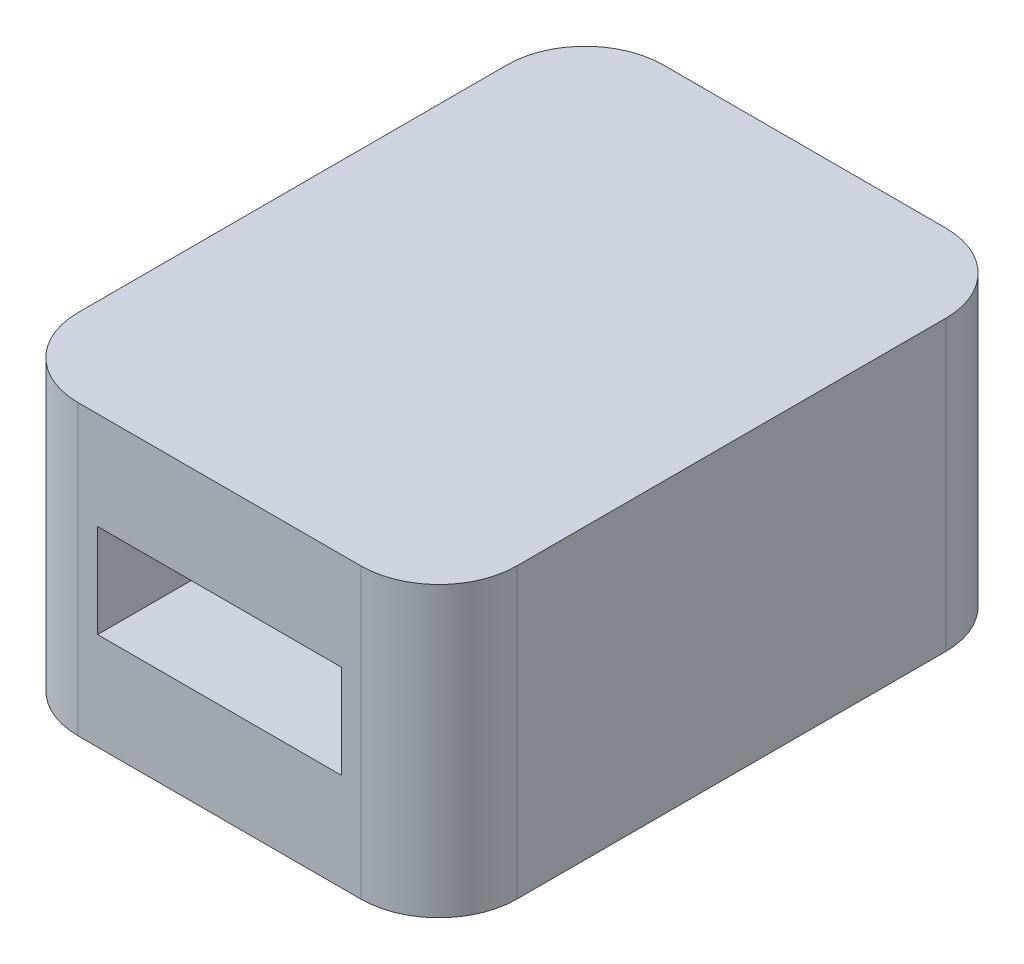
ISO-10303-21;
HEADER;
FILE_DESCRIPTION(('STEP AP214'),'2;1');
FILE_NAME('part.step','',(''),(''),'','','');
FILE_SCHEMA(('AUTOMOTIVE_DESIGN { 1 0 10303 214 1 1 1 1 }'));
ENDSEC;
DATA;
#1=APPLICATION_CONTEXT('core data for automotive mechanical design processes');
#2=APPLICATION_PROTOCOL_DEFINITION('international standard','automotive_design',2000,#1);
#3=PRODUCT_CONTEXT('',#1,'mechanical');
#4=PRODUCT('Part','Part','',(#3));
#5=PRODUCT_RELATED_PRODUCT_CATEGORY('part','',(#4));
#6=PRODUCT_DEFINITION_FORMATION('','',#4);
#7=PRODUCT_DEFINITION_CONTEXT('part definition',#1,'design');
#8=PRODUCT_DEFINITION('design','',#6,#7);
#9=PRODUCT_DEFINITION_SHAPE('','',#8);
#10=(LENGTH_UNIT() NAMED_UNIT(*) SI_UNIT(.MILLI.,.METRE.));
#11=(NAMED_UNIT(*) PLANE_ANGLE_UNIT() SI_UNIT($,.RADIAN.));
#12=(NAMED_UNIT(*) SI_UNIT($,.STERADIAN.) SOLID_ANGLE_UNIT());
#13=UNCERTAINTY_MEASURE_WITH_UNIT(LENGTH_MEASURE(1.E-05),#10,'distance_accuracy_value','');
#14=(GEOMETRIC_REPRESENTATION_CONTEXT(3) GLOBAL_UNCERTAINTY_ASSIGNED_CONTEXT((#13)) GLOBAL_UNIT_ASSIGNED_CONTEXT((#10,
#11,#12)) REPRESENTATION_CONTEXT('',''));
#15=CARTESIAN_POINT('',(0.,0.,0.));
#16=DIRECTION('',(0.,0.,1.));
#17=DIRECTION('',(1.,0.,0.));
#18=AXIS2_PLACEMENT_3D('',#15,#16,#17);
#19=CARTESIAN_POINT('',(0.,0.,15.));
#20=DIRECTION('',(0.,0.,-1.));
#21=DIRECTION('',(-1.,0.,0.));
#22=AXIS2_PLACEMENT_3D('',#19,#20,#21);
#23=PLANE('',#22);
#24=DIRECTION('',(1.,0.,0.));
#25=VECTOR('',#24,1.);
#26=CARTESIAN_POINT('',(-5.625,-3.7,15.));
#27=LINE('',#26,#25);
#28=CARTESIAN_POINT('',(-3.625,-3.7,15.));
#29=VERTEX_POINT('',#28);
#30=CARTESIAN_POINT('',(3.625,-3.7,15.));
#31=VERTEX_POINT('',#30);
#32=EDGE_CURVE('E173',#29,#31,#27,.T.);
#33=ORIENTED_EDGE('',*,*,#32,.T.);
#34=DIRECTION('',(0.,1.,0.));
#35=VECTOR('',#34,1.);
#36=CARTESIAN_POINT('',(3.625,0.,15.));
#37=LINE('',#36,#35);
#38=CARTESIAN_POINT('',(3.625,3.7,15.));
#39=VERTEX_POINT('',#38);
#40=EDGE_CURVE('E11',#31,#39,#37,.T.);
#41=ORIENTED_EDGE('',*,*,#40,.T.);
#42=DIRECTION('',(-1.,0.,0.));
#43=VECTOR('',#42,1.);
#44=CARTESIAN_POINT('',(-5.625,3.7,15.));
#45=LINE('',#44,#43);
#46=CARTESIAN_POINT('',(-3.625,3.7,15.));
#47=VERTEX_POINT('',#46);
#48=EDGE_CURVE('E170',#39,#47,#45,.T.);
#49=ORIENTED_EDGE('',*,*,#48,.T.);
#50=DIRECTION('',(0.,-1.,0.));
#51=VECTOR('',#50,1.);
#52=CARTESIAN_POINT('',(-3.625,0.,15.));
#53=LINE('',#52,#51);
#54=EDGE_CURVE('E45',#47,#29,#53,.T.);
#55=ORIENTED_EDGE('',*,*,#54,.T.);
#56=EDGE_LOOP('',(#33,#41,#49,#55));
#57=FACE_BOUND('',#56,.T.);
#58=DIRECTION('',(0.,1.,0.));
#59=VECTOR('',#58,1.);
#60=CARTESIAN_POINT('',(3.125,-1.2,15.));
#61=LINE('',#60,#59);
#62=CARTESIAN_POINT('',(3.125,-1.2,15.));
#63=VERTEX_POINT('',#62);
#64=CARTESIAN_POINT('',(3.125,1.2,15.));
#65=VERTEX_POINT('',#64);
#66=EDGE_CURVE('E129',#63,#65,#61,.T.);
#67=ORIENTED_EDGE('',*,*,#66,.F.);
#68=DIRECTION('',(1.,0.,0.));
#69=VECTOR('',#68,1.);
#70=CARTESIAN_POINT('',(-3.125,-1.2,15.));
#71=LINE('',#70,#69);
#72=CARTESIAN_POINT('',(-3.125,-1.2,15.));
#73=VERTEX_POINT('',#72);
#74=EDGE_CURVE('E154',#73,#63,#71,.T.);
#75=ORIENTED_EDGE('',*,*,#74,.F.);
#76=DIRECTION('',(0.,-1.,0.));
#77=VECTOR('',#76,1.);
#78=CARTESIAN_POINT('',(-3.125,-1.2,15.));
#79=LINE('',#78,#77);
#80=CARTESIAN_POINT('',(-3.125,1.2,15.));
#81=VERTEX_POINT('',#80);
#82=EDGE_CURVE('E152',#81,#73,#79,.T.);
#83=ORIENTED_EDGE('',*,*,#82,.F.);
#84=DIRECTION('',(-1.,0.,0.));
#85=VECTOR('',#84,1.);
#86=CARTESIAN_POINT('',(-3.125,1.2,15.));
#87=LINE('',#86,#85);
#88=EDGE_CURVE('E139',#65,#81,#87,.T.);
#89=ORIENTED_EDGE('',*,*,#88,.F.);
#90=EDGE_LOOP('',(#67,#75,#83,#89));
#91=FACE_BOUND('',#90,.T.);
#92=ADVANCED_FACE('F37',(#57,#91),#23,.F.);
#93=CARTESIAN_POINT('',(0.,0.,0.));
#94=DIRECTION('',(0.,0.,-1.));
#95=DIRECTION('',(-1.,0.,0.));
#96=AXIS2_PLACEMENT_3D('',#93,#94,#95);
#97=PLANE('',#96);
#98=DIRECTION('',(1.,0.,0.));
#99=VECTOR('',#98,1.);
#100=CARTESIAN_POINT('',(-5.625,-3.7,0.));
#101=LINE('',#100,#99);
#102=CARTESIAN_POINT('',(-3.625,-3.7,0.));
#103=VERTEX_POINT('',#102);
#104=CARTESIAN_POINT('',(3.625,-3.7,0.));
#105=VERTEX_POINT('',#104);
#106=EDGE_CURVE('E174',#103,#105,#101,.T.);
#107=ORIENTED_EDGE('',*,*,#106,.F.);
#108=DIRECTION('',(0.,-1.,0.));
#109=VECTOR('',#108,1.);
#110=CARTESIAN_POINT('',(-3.625,3.7,0.));
#111=LINE('',#110,#109);
#112=CARTESIAN_POINT('',(-3.625,3.7,0.));
#113=VERTEX_POINT('',#112);
#114=EDGE_CURVE('E207',#103,#113,#111,.F.);
#115=ORIENTED_EDGE('',*,*,#114,.T.);
#116=DIRECTION('',(-1.,0.,0.));
#117=VECTOR('',#116,1.);
#118=CARTESIAN_POINT('',(-5.625,3.7,0.));
#119=LINE('',#118,#117);
#120=CARTESIAN_POINT('',(3.625,3.7,0.));
#121=VERTEX_POINT('',#120);
#122=EDGE_CURVE('E147',#121,#113,#119,.T.);
#123=ORIENTED_EDGE('',*,*,#122,.F.);
#124=DIRECTION('',(0.,1.,0.));
#125=VECTOR('',#124,1.);
#126=CARTESIAN_POINT('',(3.625,-3.7,0.));
#127=LINE('',#126,#125);
#128=EDGE_CURVE('E205',#121,#105,#127,.F.);
#129=ORIENTED_EDGE('',*,*,#128,.T.);
#130=EDGE_LOOP('',(#107,#115,#123,#129));
#131=FACE_BOUND('',#130,.T.);
#132=DIRECTION('',(1.,0.,0.));
#133=VECTOR('',#132,1.);
#134=CARTESIAN_POINT('',(-3.125,-1.2,0.));
#135=LINE('',#134,#133);
#136=CARTESIAN_POINT('',(-3.125,-1.2,0.));
#137=VERTEX_POINT('',#136);
#138=CARTESIAN_POINT('',(3.125,-1.2,0.));
#139=VERTEX_POINT('',#138);
#140=EDGE_CURVE('E140',#137,#139,#135,.T.);
#141=ORIENTED_EDGE('',*,*,#140,.T.);
#142=DIRECTION('',(0.,1.,0.));
#143=VECTOR('',#142,1.);
#144=CARTESIAN_POINT('',(3.125,-1.2,0.));
#145=LINE('',#144,#143);
#146=CARTESIAN_POINT('',(3.125,1.2,0.));
#147=VERTEX_POINT('',#146);
#148=EDGE_CURVE('E158',#139,#147,#145,.T.);
#149=ORIENTED_EDGE('',*,*,#148,.T.);
#150=DIRECTION('',(-1.,0.,0.));
#151=VECTOR('',#150,1.);
#152=CARTESIAN_POINT('',(-3.125,1.2,0.));
#153=LINE('',#152,#151);
#154=CARTESIAN_POINT('',(-3.125,1.2,0.));
#155=VERTEX_POINT('',#154);
#156=EDGE_CURVE('E146',#147,#155,#153,.T.);
#157=ORIENTED_EDGE('',*,*,#156,.T.);
#158=DIRECTION('',(0.,-1.,0.));
#159=VECTOR('',#158,1.);
#160=CARTESIAN_POINT('',(-3.125,-1.2,0.));
#161=LINE('',#160,#159);
#162=EDGE_CURVE('E161',#155,#137,#161,.T.);
#163=ORIENTED_EDGE('',*,*,#162,.T.);
#164=EDGE_LOOP('',(#141,#149,#157,#163));
#165=FACE_BOUND('',#164,.T.);
#166=ADVANCED_FACE('F244',(#131,#165),#97,.T.);
#167=CARTESIAN_POINT('',(5.625,-3.7,15.));
#168=DIRECTION('',(-1.,0.,0.));
#169=DIRECTION('',(0.,-1.,0.));
#170=AXIS2_PLACEMENT_3D('',#167,#168,#169);
#171=PLANE('',#170);
#172=DIRECTION('',(0.,0.,-1.));
#173=VECTOR('',#172,1.);
#174=CARTESIAN_POINT('',(5.625,-3.7,15.));
#175=LINE('',#174,#173);
#176=CARTESIAN_POINT('',(5.625,-3.7,13.));
#177=VERTEX_POINT('',#176);
#178=CARTESIAN_POINT('',(5.625,-3.7,2.));
#179=VERTEX_POINT('',#178);
#180=EDGE_CURVE('E177',#177,#179,#175,.T.);
#181=ORIENTED_EDGE('',*,*,#180,.T.);
#182=DIRECTION('',(0.,1.,0.));
#183=VECTOR('',#182,1.);
#184=CARTESIAN_POINT('',(5.625,3.7,2.));
#185=LINE('',#184,#183);
#186=CARTESIAN_POINT('',(5.625,3.7,2.));
#187=VERTEX_POINT('',#186);
#188=EDGE_CURVE('E217',#179,#187,#185,.T.);
#189=ORIENTED_EDGE('',*,*,#188,.T.);
#190=DIRECTION('',(0.,0.,-1.));
#191=VECTOR('',#190,1.);
#192=CARTESIAN_POINT('',(5.625,3.7,15.));
#193=LINE('',#192,#191);
#194=CARTESIAN_POINT('',(5.625,3.7,13.));
#195=VERTEX_POINT('',#194);
#196=EDGE_CURVE('E190',#195,#187,#193,.T.);
#197=ORIENTED_EDGE('',*,*,#196,.F.);
#198=DIRECTION('',(0.,1.,0.));
#199=VECTOR('',#198,1.);
#200=CARTESIAN_POINT('',(5.625,-3.7,13.));
#201=LINE('',#200,#199);
#202=EDGE_CURVE('E215',#195,#177,#201,.F.);
#203=ORIENTED_EDGE('',*,*,#202,.T.);
#204=EDGE_LOOP('',(#181,#189,#197,#203));
#205=FACE_BOUND('',#204,.T.);
#206=ADVANCED_FACE('F251',(#205),#171,.F.);
#207=CARTESIAN_POINT('',(-5.625,3.7,15.));
#208=DIRECTION('',(0.,-1.,0.));
#209=DIRECTION('',(0.,0.,-1.));
#210=AXIS2_PLACEMENT_3D('',#207,#208,#209);
#211=PLANE('',#210);
#212=ORIENTED_EDGE('',*,*,#122,.T.);
#213=CARTESIAN_POINT('',(-3.625,3.7,2.));
#214=DIRECTION('',(0.,-1.,0.));
#215=DIRECTION('',(0.,0.,-1.));
#216=AXIS2_PLACEMENT_3D('',#213,#214,#215);
#217=CIRCLE('',#216,2.);
#218=CARTESIAN_POINT('',(-5.625,3.7,2.));
#219=VERTEX_POINT('',#218);
#220=EDGE_CURVE('E213',#113,#219,#217,.F.);
#221=ORIENTED_EDGE('',*,*,#220,.T.);
#222=DIRECTION('',(0.,0.,-1.));
#223=VECTOR('',#222,1.);
#224=CARTESIAN_POINT('',(-5.625,3.7,15.));
#225=LINE('',#224,#223);
#226=CARTESIAN_POINT('',(-5.625,3.7,13.));
#227=VERTEX_POINT('',#226);
#228=EDGE_CURVE('E187',#227,#219,#225,.T.);
#229=ORIENTED_EDGE('',*,*,#228,.F.);
#230=CARTESIAN_POINT('',(-3.625,3.7,13.));
#231=DIRECTION('',(0.,-1.,0.));
#232=DIRECTION('',(0.,0.,-1.));
#233=AXIS2_PLACEMENT_3D('',#230,#231,#232);
#234=CIRCLE('',#233,2.);
#235=EDGE_CURVE('E209',#227,#47,#234,.F.);
#236=ORIENTED_EDGE('',*,*,#235,.T.);
#237=ORIENTED_EDGE('',*,*,#48,.F.);
#238=CARTESIAN_POINT('',(3.625,3.7,13.));
#239=DIRECTION('',(0.,-1.,0.));
#240=DIRECTION('',(0.,0.,-1.));
#241=AXIS2_PLACEMENT_3D('',#238,#239,#240);
#242=CIRCLE('',#241,2.);
#243=EDGE_CURVE('E60',#39,#195,#242,.F.);
#244=ORIENTED_EDGE('',*,*,#243,.T.);
#245=ORIENTED_EDGE('',*,*,#196,.T.);
#246=CARTESIAN_POINT('',(3.625,3.7,2.));
#247=DIRECTION('',(0.,-1.,0.));
#248=DIRECTION('',(0.,0.,-1.));
#249=AXIS2_PLACEMENT_3D('',#246,#247,#248);
#250=CIRCLE('',#249,2.);
#251=EDGE_CURVE('E52',#187,#121,#250,.F.);
#252=ORIENTED_EDGE('',*,*,#251,.T.);
#253=EDGE_LOOP('',(#212,#221,#229,#236,#237,#244,#245,#252));
#254=FACE_BOUND('',#253,.T.);
#255=ADVANCED_FACE('F233',(#254),#211,.F.);
#256=CARTESIAN_POINT('',(-5.625,-3.7,15.));
#257=DIRECTION('',(1.,0.,0.));
#258=DIRECTION('',(0.,1.,0.));
#259=AXIS2_PLACEMENT_3D('',#256,#257,#258);
#260=PLANE('',#259);
#261=ORIENTED_EDGE('',*,*,#228,.T.);
#262=DIRECTION('',(0.,-1.,0.));
#263=VECTOR('',#262,1.);
#264=CARTESIAN_POINT('',(-5.625,-3.7,2.));
#265=LINE('',#264,#263);
#266=CARTESIAN_POINT('',(-5.625,-3.7,2.));
#267=VERTEX_POINT('',#266);
#268=EDGE_CURVE('E194',#219,#267,#265,.T.);
#269=ORIENTED_EDGE('',*,*,#268,.T.);
#270=DIRECTION('',(0.,0.,-1.));
#271=VECTOR('',#270,1.);
#272=CARTESIAN_POINT('',(-5.625,-3.7,15.));
#273=LINE('',#272,#271);
#274=CARTESIAN_POINT('',(-5.625,-3.7,13.));
#275=VERTEX_POINT('',#274);
#276=EDGE_CURVE('E184',#275,#267,#273,.T.);
#277=ORIENTED_EDGE('',*,*,#276,.F.);
#278=DIRECTION('',(0.,-1.,0.));
#279=VECTOR('',#278,1.);
#280=CARTESIAN_POINT('',(-5.625,-3.7,13.));
#281=LINE('',#280,#279);
#282=EDGE_CURVE('E192',#275,#227,#281,.F.);
#283=ORIENTED_EDGE('',*,*,#282,.T.);
#284=EDGE_LOOP('',(#261,#269,#277,#283));
#285=FACE_BOUND('',#284,.T.);
#286=ADVANCED_FACE('F237',(#285),#260,.F.);
#287=CARTESIAN_POINT('',(-5.625,-3.7,15.));
#288=DIRECTION('',(0.,1.,0.));
#289=DIRECTION('',(0.,0.,1.));
#290=AXIS2_PLACEMENT_3D('',#287,#288,#289);
#291=PLANE('',#290);
#292=ORIENTED_EDGE('',*,*,#276,.T.);
#293=CARTESIAN_POINT('',(-3.625,-3.7,2.));
#294=DIRECTION('',(0.,1.,0.));
#295=DIRECTION('',(0.,0.,1.));
#296=AXIS2_PLACEMENT_3D('',#293,#294,#295);
#297=CIRCLE('',#296,2.);
#298=EDGE_CURVE('E203',#267,#103,#297,.F.);
#299=ORIENTED_EDGE('',*,*,#298,.T.);
#300=ORIENTED_EDGE('',*,*,#106,.T.);
#301=CARTESIAN_POINT('',(3.625,-3.7,2.));
#302=DIRECTION('',(0.,1.,0.));
#303=DIRECTION('',(0.,0.,1.));
#304=AXIS2_PLACEMENT_3D('',#301,#302,#303);
#305=CIRCLE('',#304,2.);
#306=EDGE_CURVE('E201',#105,#179,#305,.F.);
#307=ORIENTED_EDGE('',*,*,#306,.T.);
#308=ORIENTED_EDGE('',*,*,#180,.F.);
#309=CARTESIAN_POINT('',(3.625,-3.7,13.));
#310=DIRECTION('',(0.,1.,0.));
#311=DIRECTION('',(0.,0.,1.));
#312=AXIS2_PLACEMENT_3D('',#309,#310,#311);
#313=CIRCLE('',#312,2.);
#314=EDGE_CURVE('E199',#177,#31,#313,.F.);
#315=ORIENTED_EDGE('',*,*,#314,.T.);
#316=ORIENTED_EDGE('',*,*,#32,.F.);
#317=CARTESIAN_POINT('',(-3.625,-3.7,13.));
#318=DIRECTION('',(0.,1.,0.));
#319=DIRECTION('',(0.,0.,1.));
#320=AXIS2_PLACEMENT_3D('',#317,#318,#319);
#321=CIRCLE('',#320,2.);
#322=EDGE_CURVE('E197',#29,#275,#321,.F.);
#323=ORIENTED_EDGE('',*,*,#322,.T.);
#324=EDGE_LOOP('',(#292,#299,#300,#307,#308,#315,#316,#323));
#325=FACE_BOUND('',#324,.T.);
#326=ADVANCED_FACE('F226',(#325),#291,.F.);
#327=CARTESIAN_POINT('',(3.125,-1.2,15.));
#328=DIRECTION('',(-1.,0.,0.));
#329=DIRECTION('',(0.,0.,1.));
#330=AXIS2_PLACEMENT_3D('',#327,#328,#329);
#331=PLANE('',#330);
#332=ORIENTED_EDGE('',*,*,#148,.F.);
#333=DIRECTION('',(0.,0.,-1.));
#334=VECTOR('',#333,1.);
#335=CARTESIAN_POINT('',(3.125,-1.2,15.));
#336=LINE('',#335,#334);
#337=EDGE_CURVE('E135',#63,#139,#336,.T.);
#338=ORIENTED_EDGE('',*,*,#337,.F.);
#339=ORIENTED_EDGE('',*,*,#66,.T.);
#340=DIRECTION('',(0.,0.,-1.));
#341=VECTOR('',#340,1.);
#342=CARTESIAN_POINT('',(3.125,1.2,15.));
#343=LINE('',#342,#341);
#344=EDGE_CURVE('E132',#65,#147,#343,.T.);
#345=ORIENTED_EDGE('',*,*,#344,.T.);
#346=EDGE_LOOP('',(#332,#338,#339,#345));
#347=FACE_BOUND('',#346,.T.);
#348=ADVANCED_FACE('F131',(#347),#331,.T.);
#349=CARTESIAN_POINT('',(-3.125,1.2,15.));
#350=DIRECTION('',(0.,-1.,0.));
#351=DIRECTION('',(0.,0.,-1.));
#352=AXIS2_PLACEMENT_3D('',#349,#350,#351);
#353=PLANE('',#352);
#354=ORIENTED_EDGE('',*,*,#156,.F.);
#355=ORIENTED_EDGE('',*,*,#344,.F.);
#356=ORIENTED_EDGE('',*,*,#88,.T.);
#357=DIRECTION('',(0.,0.,-1.));
#358=VECTOR('',#357,1.);
#359=CARTESIAN_POINT('',(-3.125,1.2,15.));
#360=LINE('',#359,#358);
#361=EDGE_CURVE('E148',#81,#155,#360,.T.);
#362=ORIENTED_EDGE('',*,*,#361,.T.);
#363=EDGE_LOOP('',(#354,#355,#356,#362));
#364=FACE_BOUND('',#363,.T.);
#365=ADVANCED_FACE('F143',(#364),#353,.T.);
#366=CARTESIAN_POINT('',(-3.125,-1.2,15.));
#367=DIRECTION('',(1.,0.,0.));
#368=DIRECTION('',(0.,0.,-1.));
#369=AXIS2_PLACEMENT_3D('',#366,#367,#368);
#370=PLANE('',#369);
#371=ORIENTED_EDGE('',*,*,#162,.F.);
#372=ORIENTED_EDGE('',*,*,#361,.F.);
#373=ORIENTED_EDGE('',*,*,#82,.T.);
#374=DIRECTION('',(0.,0.,-1.));
#375=VECTOR('',#374,1.);
#376=CARTESIAN_POINT('',(-3.125,-1.2,15.));
#377=LINE('',#376,#375);
#378=EDGE_CURVE('E167',#73,#137,#377,.T.);
#379=ORIENTED_EDGE('',*,*,#378,.T.);
#380=EDGE_LOOP('',(#371,#372,#373,#379));
#381=FACE_BOUND('',#380,.T.);
#382=ADVANCED_FACE('F291',(#381),#370,.T.);
#383=CARTESIAN_POINT('',(-3.125,-1.2,15.));
#384=DIRECTION('',(0.,1.,0.));
#385=DIRECTION('',(0.,0.,1.));
#386=AXIS2_PLACEMENT_3D('',#383,#384,#385);
#387=PLANE('',#386);
#388=ORIENTED_EDGE('',*,*,#140,.F.);
#389=ORIENTED_EDGE('',*,*,#378,.F.);
#390=ORIENTED_EDGE('',*,*,#74,.T.);
#391=ORIENTED_EDGE('',*,*,#337,.T.);
#392=EDGE_LOOP('',(#388,#389,#390,#391));
#393=FACE_BOUND('',#392,.T.);
#394=ADVANCED_FACE('F297',(#393),#387,.T.);
#395=CARTESIAN_POINT('',(-3.625,-3.7,2.));
#396=DIRECTION('',(0.,1.,0.));
#397=DIRECTION('',(-1.,0.,0.));
#398=AXIS2_PLACEMENT_3D('',#395,#396,#397);
#399=CYLINDRICAL_SURFACE('',#398,2.);
#400=ORIENTED_EDGE('',*,*,#220,.F.);
#401=ORIENTED_EDGE('',*,*,#114,.F.);
#402=ORIENTED_EDGE('',*,*,#298,.F.);
#403=ORIENTED_EDGE('',*,*,#268,.F.);
#404=EDGE_LOOP('',(#400,#401,#402,#403));
#405=FACE_BOUND('',#404,.T.);
#406=ADVANCED_FACE('F248',(#405),#399,.T.);
#407=CARTESIAN_POINT('',(3.625,-3.7,2.));
#408=DIRECTION('',(0.,-1.,0.));
#409=DIRECTION('',(1.,0.,0.));
#410=AXIS2_PLACEMENT_3D('',#407,#408,#409);
#411=CYLINDRICAL_SURFACE('',#410,2.);
#412=ORIENTED_EDGE('',*,*,#306,.F.);
#413=ORIENTED_EDGE('',*,*,#128,.F.);
#414=ORIENTED_EDGE('',*,*,#251,.F.);
#415=ORIENTED_EDGE('',*,*,#188,.F.);
#416=EDGE_LOOP('',(#412,#413,#414,#415));
#417=FACE_BOUND('',#416,.T.);
#418=ADVANCED_FACE('F249',(#417),#411,.T.);
#419=CARTESIAN_POINT('',(3.625,0.,13.));
#420=DIRECTION('',(0.,1.,0.));
#421=DIRECTION('',(-1.,0.,0.));
#422=AXIS2_PLACEMENT_3D('',#419,#420,#421);
#423=CYLINDRICAL_SURFACE('',#422,2.);
#424=ORIENTED_EDGE('',*,*,#314,.F.);
#425=ORIENTED_EDGE('',*,*,#202,.F.);
#426=ORIENTED_EDGE('',*,*,#243,.F.);
#427=ORIENTED_EDGE('',*,*,#40,.F.);
#428=EDGE_LOOP('',(#424,#425,#426,#427));
#429=FACE_BOUND('',#428,.T.);
#430=ADVANCED_FACE('F232',(#429),#423,.T.);
#431=CARTESIAN_POINT('',(-3.625,0.,13.));
#432=DIRECTION('',(0.,-1.,0.));
#433=DIRECTION('',(1.,0.,0.));
#434=AXIS2_PLACEMENT_3D('',#431,#432,#433);
#435=CYLINDRICAL_SURFACE('',#434,2.);
#436=ORIENTED_EDGE('',*,*,#235,.F.);
#437=ORIENTED_EDGE('',*,*,#282,.F.);
#438=ORIENTED_EDGE('',*,*,#322,.F.);
#439=ORIENTED_EDGE('',*,*,#54,.F.);
#440=EDGE_LOOP('',(#436,#437,#438,#439));
#441=FACE_BOUND('',#440,.T.);
#442=ADVANCED_FACE('F39',(#441),#435,.T.);
#443=CLOSED_SHELL('',(#92,#166,#206,#255,#286,#326,#348,#365,#382,#394,#406,#418,#430,#442));
#444=MANIFOLD_SOLID_BREP('B2',#443);
#445=ADVANCED_BREP_SHAPE_REPRESENTATION('',(#18,#444),#14);
#446=SHAPE_DEFINITION_REPRESENTATION(#9,#445);
ENDSEC;
END-ISO-10303-21;
